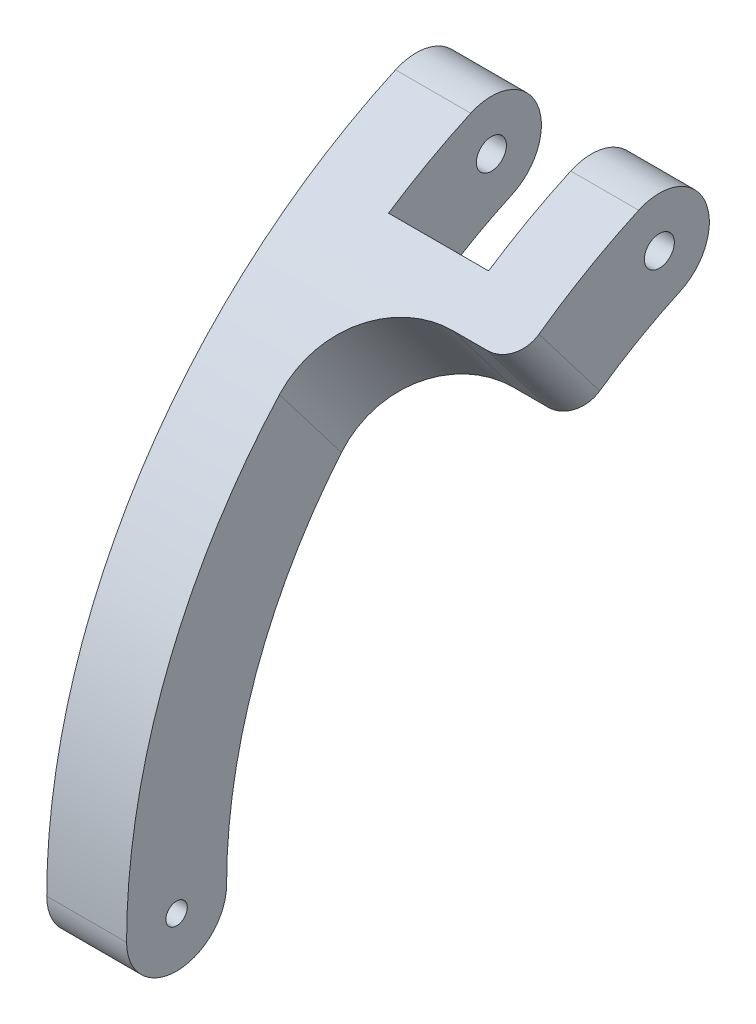
ISO-10303-21;
HEADER;
FILE_DESCRIPTION(('STEP AP214'),'2;1');
FILE_NAME('part.step','',(''),(''),'','','');
FILE_SCHEMA(('AUTOMOTIVE_DESIGN { 1 0 10303 214 1 1 1 1 }'));
ENDSEC;
DATA;
#1=APPLICATION_CONTEXT('core data for automotive mechanical design processes');
#2=APPLICATION_PROTOCOL_DEFINITION('international standard','automotive_design',2000,#1);
#3=PRODUCT_CONTEXT('',#1,'mechanical');
#4=PRODUCT('Part','Part','',(#3));
#5=PRODUCT_RELATED_PRODUCT_CATEGORY('part','',(#4));
#6=PRODUCT_DEFINITION_FORMATION('','',#4);
#7=PRODUCT_DEFINITION_CONTEXT('part definition',#1,'design');
#8=PRODUCT_DEFINITION('design','',#6,#7);
#9=PRODUCT_DEFINITION_SHAPE('','',#8);
#10=(LENGTH_UNIT() NAMED_UNIT(*) SI_UNIT(.MILLI.,.METRE.));
#11=(NAMED_UNIT(*) PLANE_ANGLE_UNIT() SI_UNIT($,.RADIAN.));
#12=(NAMED_UNIT(*) SI_UNIT($,.STERADIAN.) SOLID_ANGLE_UNIT());
#13=UNCERTAINTY_MEASURE_WITH_UNIT(LENGTH_MEASURE(1.E-05),#10,'distance_accuracy_value','');
#14=(GEOMETRIC_REPRESENTATION_CONTEXT(3) GLOBAL_UNCERTAINTY_ASSIGNED_CONTEXT((#13)) GLOBAL_UNIT_ASSIGNED_CONTEXT((#10,
#11,#12)) REPRESENTATION_CONTEXT('',''));
#15=CARTESIAN_POINT('',(0.,0.,0.));
#16=DIRECTION('',(0.,0.,1.));
#17=DIRECTION('',(1.,0.,0.));
#18=AXIS2_PLACEMENT_3D('',#15,#16,#17);
#19=CARTESIAN_POINT('',(5.588,34.6954915562757,15.7427083333333));
#20=DIRECTION('',(-1.,0.,0.));
#21=DIRECTION('',(0.,0.,1.));
#22=AXIS2_PLACEMENT_3D('',#19,#20,#21);
#23=CYLINDRICAL_SURFACE('',#22,3.5);
#24=CARTESIAN_POINT('',(5.263,34.6954915562757,15.7427083333333));
#25=DIRECTION('',(1.,0.,0.));
#26=DIRECTION('',(0.,0.,-1.));
#27=AXIS2_PLACEMENT_3D('',#24,#25,#26);
#28=CIRCLE('',#27,3.50000000000001);
#29=CARTESIAN_POINT('',(5.263,31.5082416757779,14.2965277777778));
#30=VERTEX_POINT('',#29);
#31=CARTESIAN_POINT('',(5.263,37.8827414367735,17.1888888888889));
#32=VERTEX_POINT('',#31);
#33=EDGE_CURVE('E142',#30,#32,#28,.T.);
#34=ORIENTED_EDGE('',*,*,#33,.F.);
#35=DIRECTION('',(-1.,0.,0.));
#36=VECTOR('',#35,1.);
#37=CARTESIAN_POINT('',(5.588,31.5082416757779,14.2965277777778));
#38=LINE('',#37,#36);
#39=CARTESIAN_POINT('',(0.,31.5082416757779,14.2965277777778));
#40=VERTEX_POINT('',#39);
#41=EDGE_CURVE('E204',#30,#40,#38,.T.);
#42=ORIENTED_EDGE('',*,*,#41,.T.);
#43=CARTESIAN_POINT('',(0.,34.6954915562757,15.7427083333333));
#44=DIRECTION('',(1.,0.,0.));
#45=DIRECTION('',(0.,0.,-1.));
#46=AXIS2_PLACEMENT_3D('',#43,#44,#45);
#47=CIRCLE('',#46,3.5);
#48=CARTESIAN_POINT('',(0.,37.8827414367735,17.1888888888889));
#49=VERTEX_POINT('',#48);
#50=EDGE_CURVE('E195',#40,#49,#47,.T.);
#51=ORIENTED_EDGE('',*,*,#50,.T.);
#52=DIRECTION('',(-1.,0.,0.));
#53=VECTOR('',#52,1.);
#54=CARTESIAN_POINT('',(5.588,37.8827414367735,17.1888888888889));
#55=LINE('',#54,#53);
#56=EDGE_CURVE('E201',#32,#49,#55,.T.);
#57=ORIENTED_EDGE('',*,*,#56,.F.);
#58=EDGE_LOOP('',(#34,#42,#51,#57));
#59=FACE_BOUND('',#58,.T.);
#60=ADVANCED_FACE('F34',(#59),#23,.T.);
#61=CARTESIAN_POINT('',(5.588,34.6954915562757,15.7427083333333));
#62=DIRECTION('',(-1.,0.,0.));
#63=DIRECTION('',(0.,0.,1.));
#64=AXIS2_PLACEMENT_3D('',#61,#62,#63);
#65=CYLINDRICAL_SURFACE('',#64,1.05);
#66=CARTESIAN_POINT('',(0.,34.6954915562757,15.7427083333333));
#67=DIRECTION('',(1.,0.,0.));
#68=DIRECTION('',(0.,0.,-1.));
#69=AXIS2_PLACEMENT_3D('',#66,#67,#68);
#70=CIRCLE('',#69,1.05);
#71=CARTESIAN_POINT('',(0.,34.6954915562757,14.6927083333333));
#72=VERTEX_POINT('',#71);
#73=EDGE_CURVE('E174',#72,#72,#70,.T.);
#74=ORIENTED_EDGE('',*,*,#73,.F.);
#75=EDGE_LOOP('',(#74));
#76=FACE_BOUND('',#75,.T.);
#77=CARTESIAN_POINT('',(5.263,34.6954915562757,15.7427083333333));
#78=DIRECTION('',(1.,0.,0.));
#79=DIRECTION('',(0.,0.,-1.));
#80=AXIS2_PLACEMENT_3D('',#77,#78,#79);
#81=CIRCLE('',#80,1.05);
#82=CARTESIAN_POINT('',(5.263,34.6954915562757,14.6927083333333));
#83=VERTEX_POINT('',#82);
#84=EDGE_CURVE('E150',#83,#83,#81,.T.);
#85=ORIENTED_EDGE('',*,*,#84,.T.);
#86=EDGE_LOOP('',(#85));
#87=FACE_BOUND('',#86,.T.);
#88=ADVANCED_FACE('F251',(#76,#87),#65,.F.);
#89=CARTESIAN_POINT('',(5.588,0.,19.05));
#90=DIRECTION('',(1.,0.,0.));
#91=DIRECTION('',(0.,0.,-1.));
#92=AXIS2_PLACEMENT_3D('',#89,#90,#91);
#93=PLANE('',#92);
#94=CARTESIAN_POINT('',(5.588,0.,0.));
#95=DIRECTION('',(-1.,0.,0.));
#96=DIRECTION('',(0.,0.,1.));
#97=AXIS2_PLACEMENT_3D('',#94,#95,#96);
#98=CIRCLE('',#97,34.6);
#99=CARTESIAN_POINT('',(5.588,0.,34.6));
#100=VERTEX_POINT('',#99);
#101=CARTESIAN_POINT('',(5.588,22.1727112123697,26.5618312149757));
#102=VERTEX_POINT('',#101);
#103=EDGE_CURVE('E183',#100,#102,#98,.T.);
#104=ORIENTED_EDGE('',*,*,#103,.T.);
#105=DIRECTION('',(0.,-0.794577010718344,-0.607163383314492));
#106=VECTOR('',#105,1.);
#107=CARTESIAN_POINT('',(5.588,4.54991843928045,13.0956544451675));
#108=LINE('',#107,#106);
#109=CARTESIAN_POINT('',(5.588,27.8512140628522,30.900968839588));
#110=VERTEX_POINT('',#109);
#111=EDGE_CURVE('E214',#102,#110,#108,.F.);
#112=ORIENTED_EDGE('',*,*,#111,.T.);
#113=CARTESIAN_POINT('',(5.588,0.,0.));
#114=DIRECTION('',(1.,0.,0.));
#115=DIRECTION('',(0.,0.,1.));
#116=AXIS2_PLACEMENT_3D('',#113,#114,#115);
#117=CIRCLE('',#116,41.6);
#118=CARTESIAN_POINT('',(5.588,0.,41.6));
#119=VERTEX_POINT('',#118);
#120=EDGE_CURVE('E187',#110,#119,#117,.T.);
#121=ORIENTED_EDGE('',*,*,#120,.T.);
#122=CARTESIAN_POINT('',(5.588,0.,38.1));
#123=DIRECTION('',(1.,0.,0.));
#124=DIRECTION('',(0.,0.,-1.));
#125=AXIS2_PLACEMENT_3D('',#122,#123,#124);
#126=CIRCLE('',#125,3.5);
#127=EDGE_CURVE('E180',#119,#100,#126,.T.);
#128=ORIENTED_EDGE('',*,*,#127,.T.);
#129=EDGE_LOOP('',(#104,#112,#121,#128));
#130=FACE_BOUND('',#129,.T.);
#131=CARTESIAN_POINT('',(5.588,0.,38.1));
#132=DIRECTION('',(1.,0.,0.));
#133=DIRECTION('',(0.,0.,-1.));
#134=AXIS2_PLACEMENT_3D('',#131,#132,#133);
#135=CIRCLE('',#134,0.749999999999999);
#136=CARTESIAN_POINT('',(5.588,0.,37.35));
#137=VERTEX_POINT('',#136);
#138=EDGE_CURVE('E171',#137,#137,#135,.T.);
#139=ORIENTED_EDGE('',*,*,#138,.F.);
#140=EDGE_LOOP('',(#139));
#141=FACE_BOUND('',#140,.T.);
#142=ADVANCED_FACE('F247',(#130,#141),#93,.T.);
#143=CARTESIAN_POINT('',(0.,0.,19.05));
#144=DIRECTION('',(1.,0.,0.));
#145=DIRECTION('',(0.,0.,-1.));
#146=AXIS2_PLACEMENT_3D('',#143,#144,#145);
#147=PLANE('',#146);
#148=CARTESIAN_POINT('',(0.,0.,38.1));
#149=DIRECTION('',(1.,0.,0.));
#150=DIRECTION('',(0.,0.,-1.));
#151=AXIS2_PLACEMENT_3D('',#148,#149,#150);
#152=CIRCLE('',#151,3.5);
#153=CARTESIAN_POINT('',(0.,0.,41.6));
#154=VERTEX_POINT('',#153);
#155=CARTESIAN_POINT('',(0.,0.,34.6));
#156=VERTEX_POINT('',#155);
#157=EDGE_CURVE('E179',#154,#156,#152,.T.);
#158=ORIENTED_EDGE('',*,*,#157,.F.);
#159=CARTESIAN_POINT('',(0.,0.,0.));
#160=DIRECTION('',(1.,0.,0.));
#161=DIRECTION('',(0.,0.,1.));
#162=AXIS2_PLACEMENT_3D('',#159,#160,#161);
#163=CIRCLE('',#162,41.6);
#164=EDGE_CURVE('E184',#49,#154,#163,.T.);
#165=ORIENTED_EDGE('',*,*,#164,.F.);
#166=ORIENTED_EDGE('',*,*,#50,.F.);
#167=CARTESIAN_POINT('',(0.,0.,0.));
#168=DIRECTION('',(-1.,0.,0.));
#169=DIRECTION('',(0.,0.,1.));
#170=AXIS2_PLACEMENT_3D('',#167,#168,#169);
#171=CIRCLE('',#170,34.6);
#172=EDGE_CURVE('E192',#156,#40,#171,.T.);
#173=ORIENTED_EDGE('',*,*,#172,.F.);
#174=EDGE_LOOP('',(#158,#165,#166,#173));
#175=FACE_BOUND('',#174,.T.);
#176=ORIENTED_EDGE('',*,*,#73,.T.);
#177=EDGE_LOOP('',(#176));
#178=FACE_BOUND('',#177,.T.);
#179=CARTESIAN_POINT('',(0.,0.,38.1));
#180=DIRECTION('',(1.,0.,0.));
#181=DIRECTION('',(0.,0.,-1.));
#182=AXIS2_PLACEMENT_3D('',#179,#180,#181);
#183=CIRCLE('',#182,0.749999999999999);
#184=CARTESIAN_POINT('',(0.,0.,37.35));
#185=VERTEX_POINT('',#184);
#186=EDGE_CURVE('E170',#185,#185,#183,.T.);
#187=ORIENTED_EDGE('',*,*,#186,.T.);
#188=EDGE_LOOP('',(#187));
#189=FACE_BOUND('',#188,.T.);
#190=ADVANCED_FACE('F240',(#175,#178,#189),#147,.F.);
#191=CARTESIAN_POINT('',(5.588,0.,38.1));
#192=DIRECTION('',(-1.,0.,0.));
#193=DIRECTION('',(0.,0.,1.));
#194=AXIS2_PLACEMENT_3D('',#191,#192,#193);
#195=CYLINDRICAL_SURFACE('',#194,3.5);
#196=ORIENTED_EDGE('',*,*,#157,.T.);
#197=DIRECTION('',(-1.,0.,0.));
#198=VECTOR('',#197,1.);
#199=CARTESIAN_POINT('',(5.588,0.,34.6));
#200=LINE('',#199,#198);
#201=EDGE_CURVE('E208',#100,#156,#200,.T.);
#202=ORIENTED_EDGE('',*,*,#201,.F.);
#203=ORIENTED_EDGE('',*,*,#127,.F.);
#204=DIRECTION('',(-1.,0.,0.));
#205=VECTOR('',#204,1.);
#206=CARTESIAN_POINT('',(5.588,0.,41.6));
#207=LINE('',#206,#205);
#208=EDGE_CURVE('E189',#119,#154,#207,.T.);
#209=ORIENTED_EDGE('',*,*,#208,.T.);
#210=EDGE_LOOP('',(#196,#202,#203,#209));
#211=FACE_BOUND('',#210,.T.);
#212=ADVANCED_FACE('F237',(#211),#195,.T.);
#213=CARTESIAN_POINT('',(5.588,0.,0.));
#214=DIRECTION('',(-1.,0.,0.));
#215=DIRECTION('',(0.,0.,1.));
#216=AXIS2_PLACEMENT_3D('',#213,#214,#215);
#217=CYLINDRICAL_SURFACE('',#216,34.6);
#218=CARTESIAN_POINT('',(17.018,0.,0.));
#219=DIRECTION('',(-1.,0.,0.));
#220=DIRECTION('',(0.,0.,-1.));
#221=AXIS2_PLACEMENT_3D('',#218,#219,#220);
#222=CIRCLE('',#221,34.6);
#223=CARTESIAN_POINT('',(17.018,28.2951548615784,19.9134178723618));
#224=VERTEX_POINT('',#223);
#225=CARTESIAN_POINT('',(17.018,31.5082416757779,14.2965277777778));
#226=VERTEX_POINT('',#225);
#227=EDGE_CURVE('E153',#224,#226,#222,.T.);
#228=ORIENTED_EDGE('',*,*,#227,.F.);
#229=CARTESIAN_POINT('',(17.018,28.2951548615784,19.9134178723618));
#230=CARTESIAN_POINT('',(17.0179996577187,28.2628036633329,19.9593873091402));
#231=CARTESIAN_POINT('',(17.0156323045743,28.2303544457479,20.0052550487637));
#232=CARTESIAN_POINT('',(17.0061854423247,28.1654668340914,20.0965072837461));
#233=CARTESIAN_POINT('',(16.9991061370356,28.1330284396126,20.1418917999207));
#234=CARTESIAN_POINT('',(16.9708641951419,28.03614330388,20.2767567269753));
#235=CARTESIAN_POINT('',(16.9426973602387,27.9720174089202,20.3651035897538));
#236=CARTESIAN_POINT('',(16.8684533856282,27.8466788087401,20.5361574250137));
#237=CARTESIAN_POINT('',(16.8223672343136,27.7854675867189,20.6188615351219));
#238=CARTESIAN_POINT('',(16.7135931283121,27.6678678908717,20.7763988757613));
#239=CARTESIAN_POINT('',(16.6509081031559,27.6114785683508,20.8512334919243));
#240=CARTESIAN_POINT('',(16.5107204661132,27.5053331048372,20.9910545786203));
#241=CARTESIAN_POINT('',(16.433219475266,27.4555762391863,21.0560421251444));
#242=CARTESIAN_POINT('',(16.2655715991822,27.364305906297,21.174521706792));
#243=CARTESIAN_POINT('',(16.1754221824086,27.3227940933039,21.2280114352287));
#244=CARTESIAN_POINT('',(15.9849584815815,27.2493775735148,21.3221716383996));
#245=CARTESIAN_POINT('',(15.8846338943518,27.2174827371255,21.3628289445343));
#246=CARTESIAN_POINT('',(15.676754471822,27.1644537222128,21.4302194060144));
#247=CARTESIAN_POINT('',(15.5692038559954,27.1433133246514,21.4569606089197));
#248=CARTESIAN_POINT('',(15.3871740984075,27.1177248466784,21.4892826250826));
#249=CARTESIAN_POINT('',(15.3138340919473,27.1100481079567,21.4989629634371));
#250=CARTESIAN_POINT('',(15.1663396157544,27.0998022329004,21.5118743471633));
#251=CARTESIAN_POINT('',(15.092186430017,27.0972259609671,21.5151144025741));
#252=CARTESIAN_POINT('',(15.018,27.0972343269465,21.5151084550033));
#253=B_SPLINE_CURVE_WITH_KNOTS('',3,(#229,#230,#231,#232,#233,#234,#235,#236,#237,#238,#239,
#240,#241,#242,#243,#244,#245,#246,#247,#248,#249,#250,#251,#252),.UNSPECIFIED.,.F.,.F.,(4,2,2,
2,2,2,2,2,2,2,2,4),(0.,0.168532753741135,0.337058218049818,0.673547393249284,1.01020600786474,
1.34680524525045,1.68336767581062,2.01999756447829,2.35697178710323,2.69375092334838,
2.91644193027906,3.13882116972075),.UNSPECIFIED.);
#254=CARTESIAN_POINT('',(15.018,27.0972343269465,21.5151084550033));
#255=VERTEX_POINT('',#254);
#256=EDGE_CURVE('E62',#224,#255,#253,.T.);
#257=ORIENTED_EDGE('',*,*,#256,.T.);
#258=DIRECTION('',(-1.,0.,0.));
#259=VECTOR('',#258,1.);
#260=CARTESIAN_POINT('',(17.018,27.0972343269465,21.5151084550033));
#261=LINE('',#260,#259);
#262=CARTESIAN_POINT('',(12.588,27.0972343269465,21.5151084550033));
#263=VERTEX_POINT('',#262);
#264=EDGE_CURVE('E166',#255,#263,#261,.T.);
#265=ORIENTED_EDGE('',*,*,#264,.T.);
#266=CARTESIAN_POINT('',(12.588,27.0972343269465,21.5151084550033));
#267=CARTESIAN_POINT('',(12.3913021516361,27.0972374448783,21.5150842329812));
#268=CARTESIAN_POINT('',(12.1946072052305,27.0920783013144,21.5216015805228));
#269=CARTESIAN_POINT('',(11.8026216561853,27.0714578886032,21.5475445390176));
#270=CARTESIAN_POINT('',(11.6073309931765,27.0559970650273,21.5669695916829));
#271=CARTESIAN_POINT('',(11.2196628524153,27.0148092383778,21.6185361456078));
#272=CARTESIAN_POINT('',(11.0272835427314,26.9890889956317,21.6506692729078));
#273=CARTESIAN_POINT('',(10.6466749542329,26.927428929719,21.7273101039281));
#274=CARTESIAN_POINT('',(10.4584456218024,26.8914892386666,21.7718176476753));
#275=CARTESIAN_POINT('',(10.0874076672485,26.8094444227278,21.8727664824237));
#276=CARTESIAN_POINT('',(9.90460098040533,26.7633357169995,21.9292119768789));
#277=CARTESIAN_POINT('',(9.54571843939072,26.6610409414064,22.0534661892386));
#278=CARTESIAN_POINT('',(9.36964495765475,26.6048513585335,22.1212788678637));
#279=CARTESIAN_POINT('',(9.02561627818617,26.482562535379,22.2675315021071));
#280=CARTESIAN_POINT('',(8.85765826502847,26.4164667648787,22.3459677357533));
#281=CARTESIAN_POINT('',(8.53099992481805,26.2745321358596,22.5126839922062));
#282=CARTESIAN_POINT('',(8.37229954176653,26.1986933362846,22.6009639554594));
#283=CARTESIAN_POINT('',(8.06559702578167,26.0376659885552,22.7862893715165));
#284=CARTESIAN_POINT('',(7.91757454056292,25.952496050911,22.883317310812));
#285=CARTESIAN_POINT('',(7.63299313567385,25.7730139372001,23.0852764949477));
#286=CARTESIAN_POINT('',(7.49643041076236,25.6787048184139,23.1902050942216));
#287=CARTESIAN_POINT('',(7.23566071375612,25.4812726598762,23.4069697602745));
#288=CARTESIAN_POINT('',(7.1114561804338,25.3781478878744,23.5188071834145));
#289=CARTESIAN_POINT('',(6.87631034743352,25.1635554035891,23.7482662229063));
#290=CARTESIAN_POINT('',(6.7653687952826,25.0520878501839,23.8658877290926));
#291=CARTESIAN_POINT('',(6.55818522315927,24.8220976977695,24.104995285263));
#292=CARTESIAN_POINT('',(6.46185239899211,24.703625630473,24.226451268774));
#293=CARTESIAN_POINT('',(6.28365684171385,24.4595959404047,24.4728058587749));
#294=CARTESIAN_POINT('',(6.20179404625298,24.3340383481668,24.5977044504283));
#295=CARTESIAN_POINT('',(6.05304662412975,24.0765490455354,24.8497932436242));
#296=CARTESIAN_POINT('',(5.98615972157961,23.9446183073794,24.9769830937854));
#297=CARTESIAN_POINT('',(5.86772471709776,23.6752022900137,25.2325049165047));
#298=CARTESIAN_POINT('',(5.81617354202444,23.5377181299399,25.3608366549228));
#299=CARTESIAN_POINT('',(5.71085162667211,23.2011721058863,25.6697615519023));
#300=CARTESIAN_POINT('',(5.66465630961992,22.999745630934,25.850446556728));
#301=CARTESIAN_POINT('',(5.61859425848309,22.692763530962,26.1192849082474));
#302=CARTESIAN_POINT('',(5.60711199531224,22.5896974500377,26.2084757457418));
#303=CARTESIAN_POINT('',(5.59181528610335,22.3821745481507,26.3859225204235));
#304=CARTESIAN_POINT('',(5.58800191763945,22.2777175338201,26.4741783244944));
#305=CARTESIAN_POINT('',(5.588,22.1727112123697,26.5618312149757));
#306=B_SPLINE_CURVE_WITH_KNOTS('',3,(#266,#267,#268,#269,#270,#271,#272,#273,#274,#275,#276,
#277,#278,#279,#280,#281,#282,#283,#284,#285,#286,#287,#288,#289,#290,#291,#292,#293,#294,#295,
#296,#297,#298,#299,#300,#301,#302,#303,#304,#305),.UNSPECIFIED.,.F.,.F.,(4,2,2,2,2,2,2,2,2,2,2,
2,2,2,2,2,2,2,2,4),(0.,0.589913924552679,1.1798023356317,1.76930268688315,2.35879541758374,
2.94849606028695,3.53840260385196,4.12810300516512,4.71779983904893,5.30634125464658,
5.89468646389977,6.48314754820283,7.0715974288269,7.65622484789482,8.24084974780569,
8.82538574182399,9.40980452106952,10.2311886445159,10.6413494918187,11.0515679677451),.UNSPECIFIED.);
#307=EDGE_CURVE('E216',#263,#102,#306,.T.);
#308=ORIENTED_EDGE('',*,*,#307,.T.);
#309=ORIENTED_EDGE('',*,*,#103,.F.);
#310=ORIENTED_EDGE('',*,*,#201,.T.);
#311=ORIENTED_EDGE('',*,*,#172,.T.);
#312=ORIENTED_EDGE('',*,*,#41,.F.);
#313=CARTESIAN_POINT('',(5.263,0.,0.));
#314=DIRECTION('',(-1.,0.,0.));
#315=DIRECTION('',(0.,0.,-1.));
#316=AXIS2_PLACEMENT_3D('',#313,#314,#315);
#317=CIRCLE('',#316,34.6);
#318=CARTESIAN_POINT('',(5.263,28.863664125814,19.0800653361617));
#319=VERTEX_POINT('',#318);
#320=EDGE_CURVE('E136',#319,#30,#317,.T.);
#321=ORIENTED_EDGE('',*,*,#320,.F.);
#322=DIRECTION('',(-1.,0.,0.));
#323=VECTOR('',#322,1.);
#324=CARTESIAN_POINT('',(12.263,28.863664125814,19.0800653361617));
#325=LINE('',#324,#323);
#326=CARTESIAN_POINT('',(12.263,28.863664125814,19.0800653361617));
#327=VERTEX_POINT('',#326);
#328=EDGE_CURVE('E133',#327,#319,#325,.T.);
#329=ORIENTED_EDGE('',*,*,#328,.F.);
#330=CARTESIAN_POINT('',(12.263,0.,0.));
#331=DIRECTION('',(-1.,0.,0.));
#332=DIRECTION('',(0.,0.,-1.));
#333=AXIS2_PLACEMENT_3D('',#330,#331,#332);
#334=CIRCLE('',#333,34.6);
#335=CARTESIAN_POINT('',(12.263,31.5082416757779,14.2965277777778));
#336=VERTEX_POINT('',#335);
#337=EDGE_CURVE('E155',#327,#336,#334,.T.);
#338=ORIENTED_EDGE('',*,*,#337,.T.);
#339=EDGE_CURVE('E205',#226,#336,#38,.T.);
#340=ORIENTED_EDGE('',*,*,#339,.F.);
#341=EDGE_LOOP('',(#228,#257,#265,#308,#309,#310,#311,#312,#321,#329,#338,#340));
#342=FACE_BOUND('',#341,.T.);
#343=ADVANCED_FACE('F229',(#342),#217,.F.);
#344=ORIENTED_EDGE('',*,*,#339,.T.);
#345=CARTESIAN_POINT('',(12.263,34.6954915562757,15.7427083333333));
#346=DIRECTION('',(1.,0.,0.));
#347=DIRECTION('',(0.,0.,-1.));
#348=AXIS2_PLACEMENT_3D('',#345,#346,#347);
#349=CIRCLE('',#348,3.50000000000001);
#350=CARTESIAN_POINT('',(12.263,37.8827414367735,17.1888888888889));
#351=VERTEX_POINT('',#350);
#352=EDGE_CURVE('E267',#336,#351,#349,.T.);
#353=ORIENTED_EDGE('',*,*,#352,.T.);
#354=CARTESIAN_POINT('',(17.018,37.8827414367735,17.1888888888889));
#355=VERTEX_POINT('',#354);
#356=EDGE_CURVE('E202',#355,#351,#55,.T.);
#357=ORIENTED_EDGE('',*,*,#356,.F.);
#358=CARTESIAN_POINT('',(17.018,34.6954915562757,15.7427083333333));
#359=DIRECTION('',(1.,0.,0.));
#360=DIRECTION('',(0.,0.,-1.));
#361=AXIS2_PLACEMENT_3D('',#358,#359,#360);
#362=CIRCLE('',#361,3.50000000000001);
#363=EDGE_CURVE('E160',#226,#355,#362,.T.);
#364=ORIENTED_EDGE('',*,*,#363,.F.);
#365=EDGE_LOOP('',(#344,#353,#357,#364));
#366=FACE_BOUND('',#365,.T.);
#367=ADVANCED_FACE('F246',(#366),#23,.T.);
#368=CARTESIAN_POINT('',(5.588,0.,0.));
#369=DIRECTION('',(-1.,0.,0.));
#370=DIRECTION('',(0.,0.,1.));
#371=AXIS2_PLACEMENT_3D('',#368,#369,#370);
#372=CYLINDRICAL_SURFACE('',#371,41.6);
#373=DIRECTION('',(-1.,0.,0.));
#374=VECTOR('',#373,1.);
#375=CARTESIAN_POINT('',(17.018,32.6600723158584,25.7658626155404));
#376=LINE('',#375,#374);
#377=CARTESIAN_POINT('',(15.018,32.6600723158584,25.7658626155404));
#378=VERTEX_POINT('',#377);
#379=CARTESIAN_POINT('',(12.588,32.6600723158584,25.7658626155404));
#380=VERTEX_POINT('',#379);
#381=EDGE_CURVE('E168',#378,#380,#376,.T.);
#382=ORIENTED_EDGE('',*,*,#381,.F.);
#383=CARTESIAN_POINT('',(15.018,32.6600723158584,25.7658626155404));
#384=CARTESIAN_POINT('',(15.0742678510195,32.6600720219855,25.7658619258685));
#385=CARTESIAN_POINT('',(15.1305087391276,32.6615442039787,25.7639970114655));
#386=CARTESIAN_POINT('',(15.2425879548031,32.6674139142801,25.7565545305035));
#387=CARTESIAN_POINT('',(15.2984263018692,32.6718112999178,25.7509771450122));
#388=CARTESIAN_POINT('',(15.4646393306972,32.6893427134707,25.7287242759681));
#389=CARTESIAN_POINT('',(15.5739004842453,32.7068161422346,25.7065279533776));
#390=CARTESIAN_POINT('',(15.7861262161283,32.7527621720245,25.647961693619));
#391=CARTESIAN_POINT('',(15.8890877643399,32.7812400187631,25.611584996714));
#392=CARTESIAN_POINT('',(16.0857922513776,32.8482462440548,25.5255886944877));
#393=CARTESIAN_POINT('',(16.1795367734611,32.8867728923041,25.4759713690373));
#394=CARTESIAN_POINT('',(16.3551514105732,32.9726167386672,25.3647681754915));
#395=CARTESIAN_POINT('',(16.4370209999954,33.0199343256727,25.3031817779051));
#396=CARTESIAN_POINT('',(16.5865760072276,33.1218442006556,25.1696340081137));
#397=CARTESIAN_POINT('',(16.6542587512741,33.1764378567718,25.0976706844981));
#398=CARTESIAN_POINT('',(16.7734840468169,33.2911468247228,24.9453127058968));
#399=CARTESIAN_POINT('',(16.8250292356541,33.3512612322288,24.8649194314774));
#400=CARTESIAN_POINT('',(16.9105134849566,33.4751518663394,24.6978741989097));
#401=CARTESIAN_POINT('',(16.9444627645493,33.5389259435681,24.6112259068611));
#402=CARTESIAN_POINT('',(16.9853816364131,33.6460502444537,24.4644337088467));
#403=CARTESIAN_POINT('',(16.997607045258,33.688928577274,24.4053566123534));
#404=CARTESIAN_POINT('',(17.0139152518371,33.774838471454,24.2863278466402));
#405=CARTESIAN_POINT('',(17.0180095847987,33.8178697288584,24.2263775380987));
#406=CARTESIAN_POINT('',(17.018,33.8607554968182,24.1662830651446));
#407=B_SPLINE_CURVE_WITH_KNOTS('',3,(#383,#384,#385,#386,#387,#388,#389,#390,#391,#392,#393,
#394,#395,#396,#397,#398,#399,#400,#401,#402,#403,#404,#405,#406),.UNSPECIFIED.,.F.,.F.,(4,2,2,
2,2,2,2,2,2,2,2,4),(0.,0.168699851172205,0.337391474972942,0.674216468184107,1.01120222147574,
1.34812998742975,1.68507266187808,2.02207878218813,2.35902979721534,2.69578490224044,
2.91740493709988,3.1387103433734),.UNSPECIFIED.);
#408=CARTESIAN_POINT('',(17.018,33.8607554968182,24.1662830651446));
#409=VERTEX_POINT('',#408);
#410=EDGE_CURVE('E11',#378,#409,#407,.T.);
#411=ORIENTED_EDGE('',*,*,#410,.T.);
#412=CARTESIAN_POINT('',(17.018,0.,0.));
#413=DIRECTION('',(1.,0.,0.));
#414=DIRECTION('',(0.,0.,-1.));
#415=AXIS2_PLACEMENT_3D('',#412,#413,#414);
#416=CIRCLE('',#415,41.6);
#417=EDGE_CURVE('E163',#355,#409,#416,.T.);
#418=ORIENTED_EDGE('',*,*,#417,.F.);
#419=ORIENTED_EDGE('',*,*,#356,.T.);
#420=CARTESIAN_POINT('',(12.263,0.,0.));
#421=DIRECTION('',(1.,0.,0.));
#422=DIRECTION('',(0.,0.,-1.));
#423=AXIS2_PLACEMENT_3D('',#420,#421,#422);
#424=CIRCLE('',#423,41.6);
#425=CARTESIAN_POINT('',(12.263,34.7031337466434,22.9401941613967));
#426=VERTEX_POINT('',#425);
#427=EDGE_CURVE('E149',#351,#426,#424,.T.);
#428=ORIENTED_EDGE('',*,*,#427,.T.);
#429=DIRECTION('',(-1.,0.,0.));
#430=VECTOR('',#429,1.);
#431=CARTESIAN_POINT('',(12.263,34.7031337466434,22.9401941613967));
#432=LINE('',#431,#430);
#433=CARTESIAN_POINT('',(5.263,34.7031337466434,22.9401941613967));
#434=VERTEX_POINT('',#433);
#435=EDGE_CURVE('E130',#426,#434,#432,.T.);
#436=ORIENTED_EDGE('',*,*,#435,.T.);
#437=CARTESIAN_POINT('',(5.263,0.,0.));
#438=DIRECTION('',(1.,0.,0.));
#439=DIRECTION('',(0.,0.,-1.));
#440=AXIS2_PLACEMENT_3D('',#437,#438,#439);
#441=CIRCLE('',#440,41.6);
#442=EDGE_CURVE('E137',#32,#434,#441,.T.);
#443=ORIENTED_EDGE('',*,*,#442,.F.);
#444=ORIENTED_EDGE('',*,*,#56,.T.);
#445=ORIENTED_EDGE('',*,*,#164,.T.);
#446=ORIENTED_EDGE('',*,*,#208,.F.);
#447=ORIENTED_EDGE('',*,*,#120,.F.);
#448=CARTESIAN_POINT('',(5.588,27.8512140628521,30.900968839588));
#449=CARTESIAN_POINT('',(5.587978432653,27.9977147526218,30.7689454411411));
#450=CARTESIAN_POINT('',(5.59605197124228,28.1432639878258,30.6358553212166));
#451=CARTESIAN_POINT('',(5.6283683404259,28.4315054258919,30.3685335844145));
#452=CARTESIAN_POINT('',(5.65261212415447,28.5741974598293,30.2343019007094));
#453=CARTESIAN_POINT('',(5.71723394002343,28.8556913609538,29.9657634644343));
#454=CARTESIAN_POINT('',(5.75760491775986,28.9944949006861,29.8314567702929));
#455=CARTESIAN_POINT('',(5.85429587224521,29.2673681994348,29.5637897407332));
#456=CARTESIAN_POINT('',(5.91061512379001,29.4014381733855,29.4304293625664));
#457=CARTESIAN_POINT('',(6.03896175883056,29.6641419290531,29.1656221018295));
#458=CARTESIAN_POINT('',(6.11100534319941,29.7927699394874,29.0341773430479));
#459=CARTESIAN_POINT('',(6.27032113338226,30.0436656643788,28.774480955051));
#460=CARTESIAN_POINT('',(6.35759349349147,30.1659333143776,28.6462293582034));
#461=CARTESIAN_POINT('',(6.54675456109681,30.4033618780322,28.3941114533185));
#462=CARTESIAN_POINT('',(6.64863796531404,30.5185253486506,28.2702435744014));
#463=CARTESIAN_POINT('',(6.86634204875775,30.7411710102431,28.0279766640444));
#464=CARTESIAN_POINT('',(6.98216252829188,30.8486533112388,27.9095775542807));
#465=CARTESIAN_POINT('',(7.22574378803226,31.0544001385057,27.6804573053217));
#466=CARTESIAN_POINT('',(7.3533787569329,31.1527435074295,27.5696731747224));
#467=CARTESIAN_POINT('',(7.62066607353113,31.3409481380481,27.3555351046109));
#468=CARTESIAN_POINT('',(7.76032228437649,31.4308066534494,27.2521835733716));
#469=CARTESIAN_POINT('',(8.05064281766112,31.6016332772117,27.053907396351));
#470=CARTESIAN_POINT('',(8.20130808778286,31.6826006186973,26.9589834775975));
#471=CARTESIAN_POINT('',(8.51257068947038,31.8353219892569,26.7784662904818));
#472=CARTESIAN_POINT('',(8.67316807068374,31.9070759722707,26.6928730687667));
#473=CARTESIAN_POINT('',(9.00347018217043,32.0412401976605,26.531678212481));
#474=CARTESIAN_POINT('',(9.17319147457481,32.1036326112312,26.4560956742331));
#475=CARTESIAN_POINT('',(9.52019961940649,32.2186860125404,26.3158602006903));
#476=CARTESIAN_POINT('',(9.69748388661089,32.2713502933153,26.2512035675388));
#477=CARTESIAN_POINT('',(10.0583848914086,32.3668014684921,26.1334252544128));
#478=CARTESIAN_POINT('',(10.2420000479013,32.4095908088544,26.0803007182045));
#479=CARTESIAN_POINT('',(10.6142299102192,32.4851755550551,25.9860924599508));
#480=CARTESIAN_POINT('',(10.802843514987,32.5179731423087,25.9450061097847));
#481=CARTESIAN_POINT('',(11.2546075207694,32.5838092885618,25.862312373319));
#482=CARTESIAN_POINT('',(11.5194540377971,32.6124244030029,25.8261650486223));
#483=CARTESIAN_POINT('',(11.9190451842294,32.6410195835838,25.7899987565078));
#484=CARTESIAN_POINT('',(12.0525712045454,32.6481633985468,25.7809524564401));
#485=CARTESIAN_POINT('',(12.3200527819904,32.6576884059857,25.7688847896034));
#486=CARTESIAN_POINT('',(12.454008299814,32.6600700224762,25.765862886437));
#487=CARTESIAN_POINT('',(12.588,32.6600723158584,25.7658626155404));
#488=B_SPLINE_CURVE_WITH_KNOTS('',3,(#448,#449,#450,#451,#452,#453,#454,#455,#456,#457,#458,
#459,#460,#461,#462,#463,#464,#465,#466,#467,#468,#469,#470,#471,#472,#473,#474,#475,#476,#477,
#478,#479,#480,#481,#482,#483,#484,#485,#486,#487),.UNSPECIFIED.,.F.,.F.,(4,2,2,2,2,2,2,2,2,2,2,
2,2,2,2,2,2,2,2,4),(0.,0.591477052344732,1.18298897162218,1.77424243286519,2.36546901279116,
2.95730763687409,3.54915225770788,4.14078260157393,4.73240446948682,5.31832545456523,
5.90443543931711,6.49059593719583,7.07675936534756,7.66402532739809,8.25109213032334,
8.83801336406099,9.42480636825714,10.2292643192812,10.6311477683707,11.0329954331416),.UNSPECIFIED.);
#489=EDGE_CURVE('E223',#110,#380,#488,.T.);
#490=ORIENTED_EDGE('',*,*,#489,.T.);
#491=EDGE_LOOP('',(#382,#411,#418,#419,#428,#436,#443,#444,#445,#446,#447,#490));
#492=FACE_BOUND('',#491,.T.);
#493=ADVANCED_FACE('F147',(#492),#372,.T.);
#494=CARTESIAN_POINT('',(5.588,0.,38.1));
#495=DIRECTION('',(-1.,0.,0.));
#496=DIRECTION('',(0.,0.,1.));
#497=AXIS2_PLACEMENT_3D('',#494,#495,#496);
#498=CYLINDRICAL_SURFACE('',#497,0.749999999999999);
#499=ORIENTED_EDGE('',*,*,#138,.T.);
#500=EDGE_LOOP('',(#499));
#501=FACE_BOUND('',#500,.T.);
#502=ORIENTED_EDGE('',*,*,#186,.F.);
#503=EDGE_LOOP('',(#502));
#504=FACE_BOUND('',#503,.T.);
#505=ADVANCED_FACE('F263',(#501,#504),#498,.F.);
#506=CARTESIAN_POINT('',(17.018,0.,0.));
#507=DIRECTION('',(1.,0.,0.));
#508=DIRECTION('',(0.,0.,-1.));
#509=AXIS2_PLACEMENT_3D('',#506,#507,#508);
#510=PLANE('',#509);
#511=CARTESIAN_POINT('',(17.018,34.6954915562757,15.7427083333333));
#512=DIRECTION('',(1.,0.,0.));
#513=DIRECTION('',(0.,0.,-1.));
#514=AXIS2_PLACEMENT_3D('',#511,#512,#513);
#515=CIRCLE('',#514,1.05);
#516=CARTESIAN_POINT('',(17.018,34.6954915562757,14.6927083333333));
#517=VERTEX_POINT('',#516);
#518=EDGE_CURVE('E278',#517,#517,#515,.T.);
#519=ORIENTED_EDGE('',*,*,#518,.F.);
#520=EDGE_LOOP('',(#519));
#521=FACE_BOUND('',#520,.T.);
#522=ORIENTED_EDGE('',*,*,#417,.T.);
#523=DIRECTION('',(0.,-0.794577010718344,-0.607163383314492));
#524=VECTOR('',#523,1.);
#525=CARTESIAN_POINT('',(17.018,28.3115610935755,19.9259544335666));
#526=LINE('',#525,#524);
#527=EDGE_CURVE('E332',#409,#224,#526,.T.);
#528=ORIENTED_EDGE('',*,*,#527,.T.);
#529=ORIENTED_EDGE('',*,*,#227,.T.);
#530=ORIENTED_EDGE('',*,*,#363,.T.);
#531=EDGE_LOOP('',(#522,#528,#529,#530));
#532=FACE_BOUND('',#531,.T.);
#533=ADVANCED_FACE('F304',(#521,#532),#510,.T.);
#534=CARTESIAN_POINT('',(17.018,27.0972343269465,21.5151084550033));
#535=DIRECTION('',(0.,0.607163383314492,-0.794577010718344));
#536=DIRECTION('',(0.,0.794577010718344,0.607163383314492));
#537=AXIS2_PLACEMENT_3D('',#534,#535,#536);
#538=PLANE('',#537);
#539=ORIENTED_EDGE('',*,*,#264,.F.);
#540=DIRECTION('',(0.,-0.794577010718344,-0.607163383314492));
#541=VECTOR('',#540,1.);
#542=CARTESIAN_POINT('',(15.018,32.6600723158584,25.7658626155404));
#543=LINE('',#542,#541);
#544=EDGE_CURVE('E48',#255,#378,#543,.F.);
#545=ORIENTED_EDGE('',*,*,#544,.T.);
#546=ORIENTED_EDGE('',*,*,#381,.T.);
#547=DIRECTION('',(0.,-0.794577010718344,-0.607163383314492));
#548=VECTOR('',#547,1.);
#549=CARTESIAN_POINT('',(12.588,27.0972343269465,21.5151084550033));
#550=LINE('',#549,#548);
#551=EDGE_CURVE('E210',#380,#263,#550,.T.);
#552=ORIENTED_EDGE('',*,*,#551,.T.);
#553=EDGE_LOOP('',(#539,#545,#546,#552));
#554=FACE_BOUND('',#553,.T.);
#555=ADVANCED_FACE('F303',(#554),#538,.F.);
#556=CARTESIAN_POINT('',(12.263,34.7031337466434,22.9401941613967));
#557=DIRECTION('',(0.,0.551446975033574,-0.834209945832775));
#558=DIRECTION('',(0.,0.834209945832775,0.551446975033574));
#559=AXIS2_PLACEMENT_3D('',#556,#557,#558);
#560=PLANE('',#559);
#561=ORIENTED_EDGE('',*,*,#435,.F.);
#562=DIRECTION('',(0.,-0.834209945832775,-0.551446975033574));
#563=VECTOR('',#562,1.);
#564=CARTESIAN_POINT('',(12.263,34.7031337466434,22.9401941613967));
#565=LINE('',#564,#563);
#566=EDGE_CURVE('E271',#426,#327,#565,.T.);
#567=ORIENTED_EDGE('',*,*,#566,.T.);
#568=ORIENTED_EDGE('',*,*,#328,.T.);
#569=DIRECTION('',(0.,-0.834209945832775,-0.551446975033574));
#570=VECTOR('',#569,1.);
#571=CARTESIAN_POINT('',(5.263,34.7031337466434,22.9401941613967));
#572=LINE('',#571,#570);
#573=EDGE_CURVE('E126',#434,#319,#572,.T.);
#574=ORIENTED_EDGE('',*,*,#573,.F.);
#575=EDGE_LOOP('',(#561,#567,#568,#574));
#576=FACE_BOUND('',#575,.T.);
#577=ADVANCED_FACE('F128',(#576),#560,.T.);
#578=CARTESIAN_POINT('',(12.263,34.6954915562757,15.7427083333333));
#579=DIRECTION('',(1.,0.,0.));
#580=DIRECTION('',(0.,0.,-1.));
#581=AXIS2_PLACEMENT_3D('',#578,#579,#580);
#582=PLANE('',#581);
#583=CARTESIAN_POINT('',(12.263,34.6954915562757,15.7427083333333));
#584=DIRECTION('',(1.,0.,0.));
#585=DIRECTION('',(0.,0.,-1.));
#586=AXIS2_PLACEMENT_3D('',#583,#584,#585);
#587=CIRCLE('',#586,1.05);
#588=CARTESIAN_POINT('',(12.263,34.6954915562757,14.6927083333333));
#589=VERTEX_POINT('',#588);
#590=EDGE_CURVE('E281',#589,#589,#587,.T.);
#591=ORIENTED_EDGE('',*,*,#590,.T.);
#592=EDGE_LOOP('',(#591));
#593=FACE_BOUND('',#592,.T.);
#594=ORIENTED_EDGE('',*,*,#352,.F.);
#595=ORIENTED_EDGE('',*,*,#337,.F.);
#596=ORIENTED_EDGE('',*,*,#566,.F.);
#597=ORIENTED_EDGE('',*,*,#427,.F.);
#598=EDGE_LOOP('',(#594,#595,#596,#597));
#599=FACE_BOUND('',#598,.T.);
#600=ADVANCED_FACE('F285',(#593,#599),#582,.F.);
#601=CARTESIAN_POINT('',(5.263,34.6954915562757,15.7427083333333));
#602=DIRECTION('',(1.,0.,0.));
#603=DIRECTION('',(0.,0.,-1.));
#604=AXIS2_PLACEMENT_3D('',#601,#602,#603);
#605=PLANE('',#604);
#606=ORIENTED_EDGE('',*,*,#84,.F.);
#607=EDGE_LOOP('',(#606));
#608=FACE_BOUND('',#607,.T.);
#609=ORIENTED_EDGE('',*,*,#33,.T.);
#610=ORIENTED_EDGE('',*,*,#442,.T.);
#611=ORIENTED_EDGE('',*,*,#573,.T.);
#612=ORIENTED_EDGE('',*,*,#320,.T.);
#613=EDGE_LOOP('',(#609,#610,#611,#612));
#614=FACE_BOUND('',#613,.T.);
#615=ADVANCED_FACE('F140',(#608,#614),#605,.T.);
#616=CARTESIAN_POINT('',(12.588,22.8470906437451,27.0771475300317));
#617=DIRECTION('',(0.,-0.794577010718344,-0.607163383314492));
#618=DIRECTION('',(0.,0.607163383314492,-0.794577010718344));
#619=AXIS2_PLACEMENT_3D('',#616,#617,#618);
#620=CYLINDRICAL_SURFACE('',#619,7.);
#621=ORIENTED_EDGE('',*,*,#489,.F.);
#622=ORIENTED_EDGE('',*,*,#111,.F.);
#623=ORIENTED_EDGE('',*,*,#307,.F.);
#624=ORIENTED_EDGE('',*,*,#551,.F.);
#625=EDGE_LOOP('',(#621,#622,#623,#624));
#626=FACE_BOUND('',#625,.T.);
#627=ADVANCED_FACE('F233',(#626),#620,.F.);
#628=CARTESIAN_POINT('',(15.018,0.823943729302659,-1.07827112671965));
#629=DIRECTION('',(0.,0.794577010718344,0.607163383314492));
#630=DIRECTION('',(0.,-0.607163383314492,0.794577010718344));
#631=AXIS2_PLACEMENT_3D('',#628,#629,#630);
#632=CYLINDRICAL_SURFACE('',#631,2.);
#633=ORIENTED_EDGE('',*,*,#410,.F.);
#634=ORIENTED_EDGE('',*,*,#544,.F.);
#635=ORIENTED_EDGE('',*,*,#256,.F.);
#636=ORIENTED_EDGE('',*,*,#527,.F.);
#637=EDGE_LOOP('',(#633,#634,#635,#636));
#638=FACE_BOUND('',#637,.T.);
#639=ADVANCED_FACE('F36',(#638),#632,.T.);
#640=CARTESIAN_POINT('',(17.1307979899148,34.6954915562757,15.7427083333333));
#641=DIRECTION('',(-1.,0.,0.));
#642=DIRECTION('',(0.,0.,1.));
#643=AXIS2_PLACEMENT_3D('',#640,#641,#642);
#644=CYLINDRICAL_SURFACE('',#643,1.05);
#645=ORIENTED_EDGE('',*,*,#518,.T.);
#646=EDGE_LOOP('',(#645));
#647=FACE_BOUND('',#646,.T.);
#648=ORIENTED_EDGE('',*,*,#590,.F.);
#649=EDGE_LOOP('',(#648));
#650=FACE_BOUND('',#649,.T.);
#651=ADVANCED_FACE('F287',(#647,#650),#644,.F.);
#652=CLOSED_SHELL('',(#60,#88,#142,#190,#212,#343,#367,#493,#505,#533,#555,#577,#600,#615,#627,
#639,#651));
#653=MANIFOLD_SOLID_BREP('B2',#652);
#654=ADVANCED_BREP_SHAPE_REPRESENTATION('',(#18,#653),#14);
#655=SHAPE_DEFINITION_REPRESENTATION(#9,#654);
ENDSEC;
END-ISO-10303-21;
